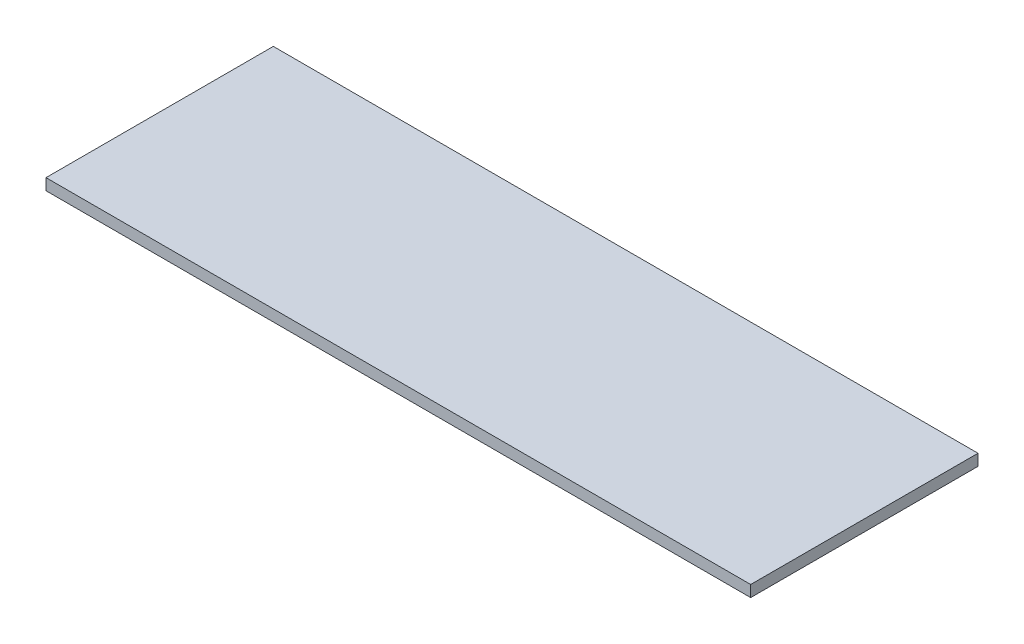
ISO-10303-21;
HEADER;
FILE_DESCRIPTION(('STEP AP214'),'2;1');
FILE_NAME('part.step','',(''),(''),'','','');
FILE_SCHEMA(('AUTOMOTIVE_DESIGN { 1 0 10303 214 1 1 1 1 }'));
ENDSEC;
DATA;
#1=APPLICATION_CONTEXT('core data for automotive mechanical design processes');
#2=APPLICATION_PROTOCOL_DEFINITION('international standard','automotive_design',2000,#1);
#3=PRODUCT_CONTEXT('',#1,'mechanical');
#4=PRODUCT('Part','Part','',(#3));
#5=PRODUCT_RELATED_PRODUCT_CATEGORY('part','',(#4));
#6=PRODUCT_DEFINITION_FORMATION('','',#4);
#7=PRODUCT_DEFINITION_CONTEXT('part definition',#1,'design');
#8=PRODUCT_DEFINITION('design','',#6,#7);
#9=PRODUCT_DEFINITION_SHAPE('','',#8);
#10=(LENGTH_UNIT() NAMED_UNIT(*) SI_UNIT(.MILLI.,.METRE.));
#11=(NAMED_UNIT(*) PLANE_ANGLE_UNIT() SI_UNIT($,.RADIAN.));
#12=(NAMED_UNIT(*) SI_UNIT($,.STERADIAN.) SOLID_ANGLE_UNIT());
#13=UNCERTAINTY_MEASURE_WITH_UNIT(LENGTH_MEASURE(1.E-05),#10,'distance_accuracy_value','');
#14=(GEOMETRIC_REPRESENTATION_CONTEXT(3) GLOBAL_UNCERTAINTY_ASSIGNED_CONTEXT((#13)) GLOBAL_UNIT_ASSIGNED_CONTEXT((#10,
#11,#12)) REPRESENTATION_CONTEXT('',''));
#15=CARTESIAN_POINT('',(0.,0.,0.));
#16=DIRECTION('',(0.,0.,1.));
#17=DIRECTION('',(1.,0.,0.));
#18=AXIS2_PLACEMENT_3D('',#15,#16,#17);
#19=CARTESIAN_POINT('',(98.425,3.175,-31.75));
#20=DIRECTION('',(-1.,0.,0.));
#21=DIRECTION('',(0.,0.,1.));
#22=AXIS2_PLACEMENT_3D('',#19,#20,#21);
#23=PLANE('',#22);
#24=DIRECTION('',(0.,0.,-1.));
#25=VECTOR('',#24,1.);
#26=CARTESIAN_POINT('',(98.425,0.,-31.75));
#27=LINE('',#26,#25);
#28=CARTESIAN_POINT('',(98.425,0.,31.75));
#29=VERTEX_POINT('',#28);
#30=CARTESIAN_POINT('',(98.425,0.,-31.75));
#31=VERTEX_POINT('',#30);
#32=EDGE_CURVE('E99',#29,#31,#27,.T.);
#33=ORIENTED_EDGE('',*,*,#32,.T.);
#34=DIRECTION('',(0.,-1.,0.));
#35=VECTOR('',#34,1.);
#36=CARTESIAN_POINT('',(98.425,3.175,-31.75));
#37=LINE('',#36,#35);
#38=CARTESIAN_POINT('',(98.425,3.175,-31.75));
#39=VERTEX_POINT('',#38);
#40=EDGE_CURVE('E11',#39,#31,#37,.T.);
#41=ORIENTED_EDGE('',*,*,#40,.F.);
#42=DIRECTION('',(0.,0.,-1.));
#43=VECTOR('',#42,1.);
#44=CARTESIAN_POINT('',(98.425,3.175,-31.75));
#45=LINE('',#44,#43);
#46=CARTESIAN_POINT('',(98.425,3.175,31.75));
#47=VERTEX_POINT('',#46);
#48=EDGE_CURVE('E87',#47,#39,#45,.T.);
#49=ORIENTED_EDGE('',*,*,#48,.F.);
#50=DIRECTION('',(0.,-1.,0.));
#51=VECTOR('',#50,1.);
#52=CARTESIAN_POINT('',(98.425,3.175,31.75));
#53=LINE('',#52,#51);
#54=EDGE_CURVE('E95',#47,#29,#53,.T.);
#55=ORIENTED_EDGE('',*,*,#54,.T.);
#56=EDGE_LOOP('',(#33,#41,#49,#55));
#57=FACE_BOUND('',#56,.T.);
#58=ADVANCED_FACE('F36',(#57),#23,.F.);
#59=CARTESIAN_POINT('',(-98.425,3.175,-31.75));
#60=DIRECTION('',(0.,0.,1.));
#61=DIRECTION('',(1.,0.,0.));
#62=AXIS2_PLACEMENT_3D('',#59,#60,#61);
#63=PLANE('',#62);
#64=DIRECTION('',(-1.,0.,0.));
#65=VECTOR('',#64,1.);
#66=CARTESIAN_POINT('',(-98.425,0.,-31.75));
#67=LINE('',#66,#65);
#68=CARTESIAN_POINT('',(-98.425,0.,-31.75));
#69=VERTEX_POINT('',#68);
#70=EDGE_CURVE('E91',#31,#69,#67,.T.);
#71=ORIENTED_EDGE('',*,*,#70,.T.);
#72=DIRECTION('',(0.,-1.,0.));
#73=VECTOR('',#72,1.);
#74=CARTESIAN_POINT('',(-98.425,3.175,-31.75));
#75=LINE('',#74,#73);
#76=CARTESIAN_POINT('',(-98.425,3.175,-31.75));
#77=VERTEX_POINT('',#76);
#78=EDGE_CURVE('E44',#77,#69,#75,.T.);
#79=ORIENTED_EDGE('',*,*,#78,.F.);
#80=DIRECTION('',(-1.,0.,0.));
#81=VECTOR('',#80,1.);
#82=CARTESIAN_POINT('',(-98.425,3.175,-31.75));
#83=LINE('',#82,#81);
#84=EDGE_CURVE('E82',#39,#77,#83,.T.);
#85=ORIENTED_EDGE('',*,*,#84,.F.);
#86=ORIENTED_EDGE('',*,*,#40,.T.);
#87=EDGE_LOOP('',(#71,#79,#85,#86));
#88=FACE_BOUND('',#87,.T.);
#89=ADVANCED_FACE('F90',(#88),#63,.F.);
#90=CARTESIAN_POINT('',(-98.425,3.175,-31.75));
#91=DIRECTION('',(1.,0.,0.));
#92=DIRECTION('',(0.,0.,-1.));
#93=AXIS2_PLACEMENT_3D('',#90,#91,#92);
#94=PLANE('',#93);
#95=DIRECTION('',(0.,0.,1.));
#96=VECTOR('',#95,1.);
#97=CARTESIAN_POINT('',(-98.425,0.,-31.75));
#98=LINE('',#97,#96);
#99=CARTESIAN_POINT('',(-98.425,0.,31.75));
#100=VERTEX_POINT('',#99);
#101=EDGE_CURVE('E69',#69,#100,#98,.T.);
#102=ORIENTED_EDGE('',*,*,#101,.T.);
#103=DIRECTION('',(0.,-1.,0.));
#104=VECTOR('',#103,1.);
#105=CARTESIAN_POINT('',(-98.425,3.175,31.75));
#106=LINE('',#105,#104);
#107=CARTESIAN_POINT('',(-98.425,3.175,31.75));
#108=VERTEX_POINT('',#107);
#109=EDGE_CURVE('E92',#108,#100,#106,.T.);
#110=ORIENTED_EDGE('',*,*,#109,.F.);
#111=DIRECTION('',(0.,0.,1.));
#112=VECTOR('',#111,1.);
#113=CARTESIAN_POINT('',(-98.425,3.175,-31.75));
#114=LINE('',#113,#112);
#115=EDGE_CURVE('E85',#77,#108,#114,.T.);
#116=ORIENTED_EDGE('',*,*,#115,.F.);
#117=ORIENTED_EDGE('',*,*,#78,.T.);
#118=EDGE_LOOP('',(#102,#110,#116,#117));
#119=FACE_BOUND('',#118,.T.);
#120=ADVANCED_FACE('F93',(#119),#94,.F.);
#121=CARTESIAN_POINT('',(-98.425,3.175,31.75));
#122=DIRECTION('',(0.,0.,-1.));
#123=DIRECTION('',(-1.,0.,0.));
#124=AXIS2_PLACEMENT_3D('',#121,#122,#123);
#125=PLANE('',#124);
#126=DIRECTION('',(1.,0.,0.));
#127=VECTOR('',#126,1.);
#128=CARTESIAN_POINT('',(-98.425,0.,31.75));
#129=LINE('',#128,#127);
#130=EDGE_CURVE('E75',#100,#29,#129,.T.);
#131=ORIENTED_EDGE('',*,*,#130,.T.);
#132=ORIENTED_EDGE('',*,*,#54,.F.);
#133=DIRECTION('',(1.,0.,0.));
#134=VECTOR('',#133,1.);
#135=CARTESIAN_POINT('',(-98.425,3.175,31.75));
#136=LINE('',#135,#134);
#137=EDGE_CURVE('E52',#108,#47,#136,.T.);
#138=ORIENTED_EDGE('',*,*,#137,.F.);
#139=ORIENTED_EDGE('',*,*,#109,.T.);
#140=EDGE_LOOP('',(#131,#132,#138,#139));
#141=FACE_BOUND('',#140,.T.);
#142=ADVANCED_FACE('F106',(#141),#125,.F.);
#143=CARTESIAN_POINT('',(0.,3.175,0.));
#144=DIRECTION('',(0.,1.,0.));
#145=DIRECTION('',(0.,0.,1.));
#146=AXIS2_PLACEMENT_3D('',#143,#144,#145);
#147=PLANE('',#146);
#148=ORIENTED_EDGE('',*,*,#48,.T.);
#149=ORIENTED_EDGE('',*,*,#84,.T.);
#150=ORIENTED_EDGE('',*,*,#115,.T.);
#151=ORIENTED_EDGE('',*,*,#137,.T.);
#152=EDGE_LOOP('',(#148,#149,#150,#151));
#153=FACE_BOUND('',#152,.T.);
#154=ADVANCED_FACE('F83',(#153),#147,.T.);
#155=CARTESIAN_POINT('',(0.,0.,0.));
#156=DIRECTION('',(0.,1.,0.));
#157=DIRECTION('',(0.,0.,1.));
#158=AXIS2_PLACEMENT_3D('',#155,#156,#157);
#159=PLANE('',#158);
#160=ORIENTED_EDGE('',*,*,#32,.F.);
#161=ORIENTED_EDGE('',*,*,#130,.F.);
#162=ORIENTED_EDGE('',*,*,#101,.F.);
#163=ORIENTED_EDGE('',*,*,#70,.F.);
#164=EDGE_LOOP('',(#160,#161,#162,#163));
#165=FACE_BOUND('',#164,.T.);
#166=ADVANCED_FACE('F109',(#165),#159,.F.);
#167=CLOSED_SHELL('',(#58,#89,#120,#142,#154,#166));
#168=MANIFOLD_SOLID_BREP('B2',#167);
#169=ADVANCED_BREP_SHAPE_REPRESENTATION('',(#18,#168),#14);
#170=SHAPE_DEFINITION_REPRESENTATION(#9,#169);
ENDSEC;
END-ISO-10303-21;
